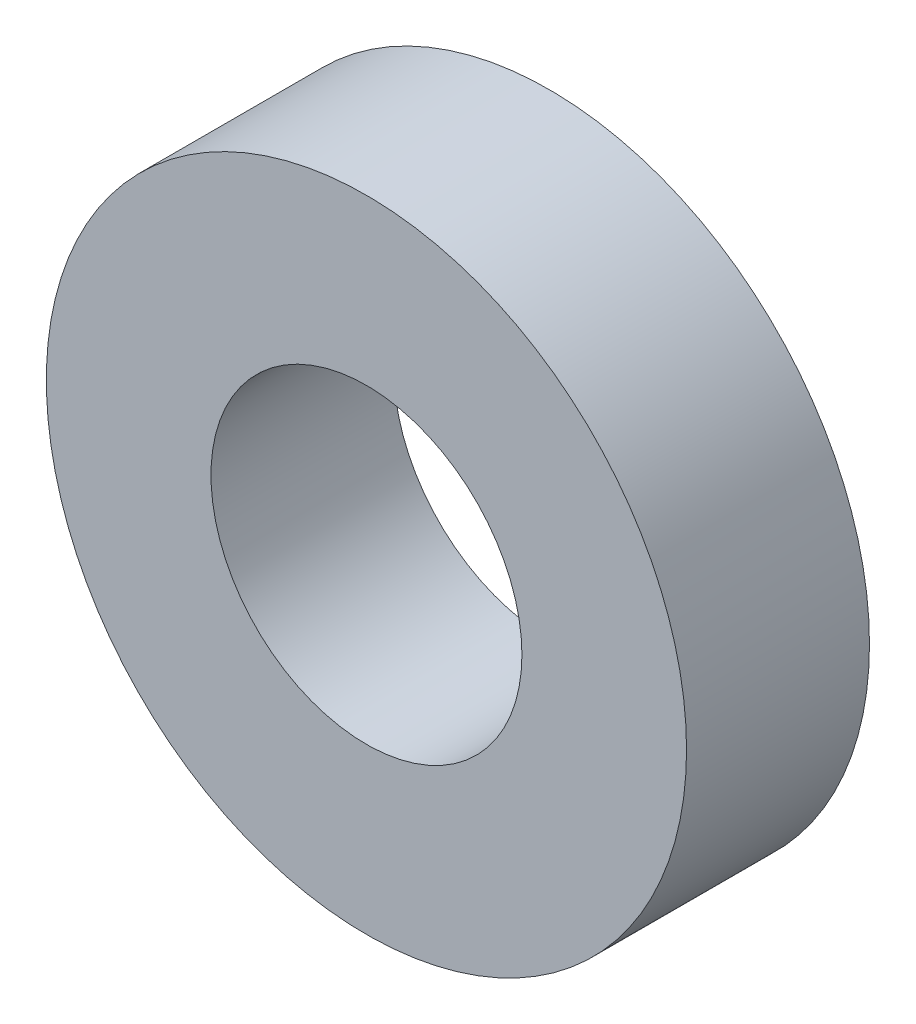
ISO-10303-21;
HEADER;
FILE_DESCRIPTION(('STEP AP214'),'2;1');
FILE_NAME('part.step','',(''),(''),'','','');
FILE_SCHEMA(('AUTOMOTIVE_DESIGN { 1 0 10303 214 1 1 1 1 }'));
ENDSEC;
DATA;
#1=APPLICATION_CONTEXT('core data for automotive mechanical design processes');
#2=APPLICATION_PROTOCOL_DEFINITION('international standard','automotive_design',2000,#1);
#3=PRODUCT_CONTEXT('',#1,'mechanical');
#4=PRODUCT('Part','Part','',(#3));
#5=PRODUCT_RELATED_PRODUCT_CATEGORY('part','',(#4));
#6=PRODUCT_DEFINITION_FORMATION('','',#4);
#7=PRODUCT_DEFINITION_CONTEXT('part definition',#1,'design');
#8=PRODUCT_DEFINITION('design','',#6,#7);
#9=PRODUCT_DEFINITION_SHAPE('','',#8);
#10=(LENGTH_UNIT() NAMED_UNIT(*) SI_UNIT(.MILLI.,.METRE.));
#11=(NAMED_UNIT(*) PLANE_ANGLE_UNIT() SI_UNIT($,.RADIAN.));
#12=(NAMED_UNIT(*) SI_UNIT($,.STERADIAN.) SOLID_ANGLE_UNIT());
#13=UNCERTAINTY_MEASURE_WITH_UNIT(LENGTH_MEASURE(1.E-05),#10,'distance_accuracy_value','');
#14=(GEOMETRIC_REPRESENTATION_CONTEXT(3) GLOBAL_UNCERTAINTY_ASSIGNED_CONTEXT((#13)) GLOBAL_UNIT_ASSIGNED_CONTEXT((#10,
#11,#12)) REPRESENTATION_CONTEXT('',''));
#15=CARTESIAN_POINT('',(0.,0.,0.));
#16=DIRECTION('',(0.,0.,1.));
#17=DIRECTION('',(1.,0.,0.));
#18=AXIS2_PLACEMENT_3D('',#15,#16,#17);
#19=CARTESIAN_POINT('',(0.,0.,2.));
#20=DIRECTION('',(0.,0.,1.));
#21=DIRECTION('',(1.,0.,0.));
#22=AXIS2_PLACEMENT_3D('',#19,#20,#21);
#23=PLANE('',#22);
#24=CARTESIAN_POINT('',(0.,0.,2.));
#25=DIRECTION('',(0.,0.,1.));
#26=DIRECTION('',(1.,0.,0.));
#27=AXIS2_PLACEMENT_3D('',#24,#25,#26);
#28=CIRCLE('',#27,3.5);
#29=CARTESIAN_POINT('',(3.5,0.,2.));
#30=VERTEX_POINT('',#29);
#31=EDGE_CURVE('E10',#30,#30,#28,.T.);
#32=ORIENTED_EDGE('',*,*,#31,.T.);
#33=EDGE_LOOP('',(#32));
#34=FACE_BOUND('',#33,.T.);
#35=CARTESIAN_POINT('',(0.,0.,2.));
#36=DIRECTION('',(0.,0.,1.));
#37=DIRECTION('',(1.,0.,0.));
#38=AXIS2_PLACEMENT_3D('',#35,#36,#37);
#39=CIRCLE('',#38,1.7);
#40=CARTESIAN_POINT('',(1.7,0.,2.));
#41=VERTEX_POINT('',#40);
#42=EDGE_CURVE('E57',#41,#41,#39,.T.);
#43=ORIENTED_EDGE('',*,*,#42,.F.);
#44=EDGE_LOOP('',(#43));
#45=FACE_BOUND('',#44,.T.);
#46=ADVANCED_FACE('F43',(#34,#45),#23,.T.);
#47=CARTESIAN_POINT('',(0.,0.,0.));
#48=DIRECTION('',(0.,0.,1.));
#49=DIRECTION('',(1.,0.,0.));
#50=AXIS2_PLACEMENT_3D('',#47,#48,#49);
#51=PLANE('',#50);
#52=CARTESIAN_POINT('',(0.,0.,0.));
#53=DIRECTION('',(0.,0.,1.));
#54=DIRECTION('',(1.,0.,0.));
#55=AXIS2_PLACEMENT_3D('',#52,#53,#54);
#56=CIRCLE('',#55,3.5);
#57=CARTESIAN_POINT('',(3.5,0.,0.));
#58=VERTEX_POINT('',#57);
#59=EDGE_CURVE('E47',#58,#58,#56,.T.);
#60=ORIENTED_EDGE('',*,*,#59,.F.);
#61=EDGE_LOOP('',(#60));
#62=FACE_BOUND('',#61,.T.);
#63=CARTESIAN_POINT('',(0.,0.,0.));
#64=DIRECTION('',(0.,0.,1.));
#65=DIRECTION('',(1.,0.,0.));
#66=AXIS2_PLACEMENT_3D('',#63,#64,#65);
#67=CIRCLE('',#66,1.7);
#68=CARTESIAN_POINT('',(1.7,0.,0.));
#69=VERTEX_POINT('',#68);
#70=EDGE_CURVE('E59',#69,#69,#67,.T.);
#71=ORIENTED_EDGE('',*,*,#70,.T.);
#72=EDGE_LOOP('',(#71));
#73=FACE_BOUND('',#72,.T.);
#74=ADVANCED_FACE('F70',(#62,#73),#51,.F.);
#75=CARTESIAN_POINT('',(0.,0.,2.));
#76=DIRECTION('',(0.,0.,-1.));
#77=DIRECTION('',(-1.,0.,0.));
#78=AXIS2_PLACEMENT_3D('',#75,#76,#77);
#79=CYLINDRICAL_SURFACE('',#78,3.5);
#80=ORIENTED_EDGE('',*,*,#31,.F.);
#81=EDGE_LOOP('',(#80));
#82=FACE_BOUND('',#81,.T.);
#83=ORIENTED_EDGE('',*,*,#59,.T.);
#84=EDGE_LOOP('',(#83));
#85=FACE_BOUND('',#84,.T.);
#86=ADVANCED_FACE('F45',(#82,#85),#79,.T.);
#87=CARTESIAN_POINT('',(0.,0.,2.));
#88=DIRECTION('',(0.,0.,-1.));
#89=DIRECTION('',(-1.,0.,0.));
#90=AXIS2_PLACEMENT_3D('',#87,#88,#89);
#91=CYLINDRICAL_SURFACE('',#90,1.7);
#92=ORIENTED_EDGE('',*,*,#42,.T.);
#93=EDGE_LOOP('',(#92));
#94=FACE_BOUND('',#93,.T.);
#95=ORIENTED_EDGE('',*,*,#70,.F.);
#96=EDGE_LOOP('',(#95));
#97=FACE_BOUND('',#96,.T.);
#98=ADVANCED_FACE('F66',(#94,#97),#91,.F.);
#99=CLOSED_SHELL('',(#46,#74,#86,#98));
#100=MANIFOLD_SOLID_BREP('B2',#99);
#101=ADVANCED_BREP_SHAPE_REPRESENTATION('',(#18,#100),#14);
#102=SHAPE_DEFINITION_REPRESENTATION(#9,#101);
ENDSEC;
END-ISO-10303-21;
